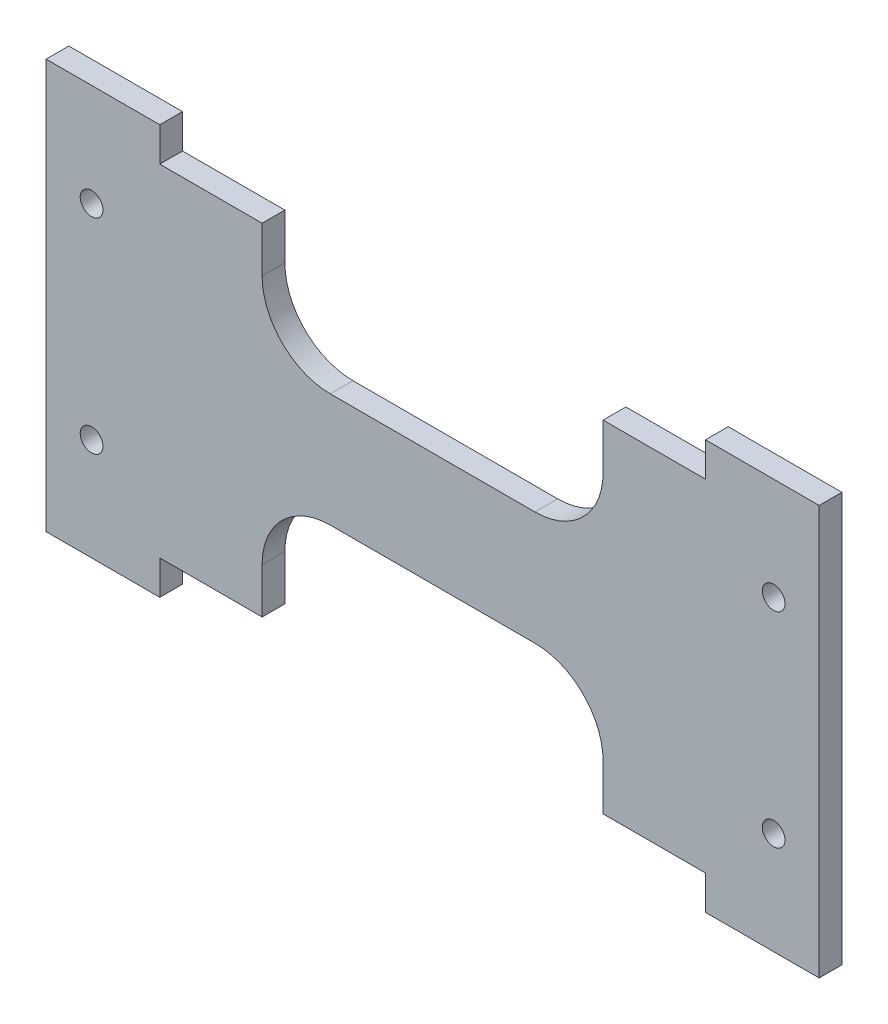
ISO-10303-21;
HEADER;
FILE_DESCRIPTION(('STEP AP214'),'2;1');
FILE_NAME('part.step','',(''),(''),'','','');
FILE_SCHEMA(('AUTOMOTIVE_DESIGN { 1 0 10303 214 1 1 1 1 }'));
ENDSEC;
DATA;
#1=APPLICATION_CONTEXT('core data for automotive mechanical design processes');
#2=APPLICATION_PROTOCOL_DEFINITION('international standard','automotive_design',2000,#1);
#3=PRODUCT_CONTEXT('',#1,'mechanical');
#4=PRODUCT('Part','Part','',(#3));
#5=PRODUCT_RELATED_PRODUCT_CATEGORY('part','',(#4));
#6=PRODUCT_DEFINITION_FORMATION('','',#4);
#7=PRODUCT_DEFINITION_CONTEXT('part definition',#1,'design');
#8=PRODUCT_DEFINITION('design','',#6,#7);
#9=PRODUCT_DEFINITION_SHAPE('','',#8);
#10=(LENGTH_UNIT() NAMED_UNIT(*) SI_UNIT(.MILLI.,.METRE.));
#11=(NAMED_UNIT(*) PLANE_ANGLE_UNIT() SI_UNIT($,.RADIAN.));
#12=(NAMED_UNIT(*) SI_UNIT($,.STERADIAN.) SOLID_ANGLE_UNIT());
#13=UNCERTAINTY_MEASURE_WITH_UNIT(LENGTH_MEASURE(1.E-05),#10,'distance_accuracy_value','');
#14=(GEOMETRIC_REPRESENTATION_CONTEXT(3) GLOBAL_UNCERTAINTY_ASSIGNED_CONTEXT((#13)) GLOBAL_UNIT_ASSIGNED_CONTEXT((#10,
#11,#12)) REPRESENTATION_CONTEXT('',''));
#15=CARTESIAN_POINT('',(0.,0.,0.));
#16=DIRECTION('',(0.,0.,1.));
#17=DIRECTION('',(1.,0.,0.));
#18=AXIS2_PLACEMENT_3D('',#15,#16,#17);
#19=CARTESIAN_POINT('',(8.99999999999999,-5.99999999999999,2.));
#20=DIRECTION('',(0.,0.,1.));
#21=DIRECTION('',(1.,0.,0.));
#22=AXIS2_PLACEMENT_3D('',#19,#20,#21);
#23=PLANE('',#22);
#24=CARTESIAN_POINT('',(-30.,14.,2.));
#25=DIRECTION('',(0.,0.,1.));
#26=DIRECTION('',(1.,0.,0.));
#27=AXIS2_PLACEMENT_3D('',#24,#25,#26);
#28=CIRCLE('',#27,0.999999999999997);
#29=CARTESIAN_POINT('',(-29.,14.,2.));
#30=VERTEX_POINT('',#29);
#31=EDGE_CURVE('E458',#30,#30,#28,.T.);
#32=ORIENTED_EDGE('',*,*,#31,.F.);
#33=EDGE_LOOP('',(#32));
#34=FACE_BOUND('',#33,.T.);
#35=CARTESIAN_POINT('',(30.,-4.,2.));
#36=DIRECTION('',(0.,0.,1.));
#37=DIRECTION('',(1.,0.,0.));
#38=AXIS2_PLACEMENT_3D('',#35,#36,#37);
#39=CIRCLE('',#38,1.);
#40=CARTESIAN_POINT('',(31.,-4.,2.));
#41=VERTEX_POINT('',#40);
#42=EDGE_CURVE('E241',#41,#41,#39,.T.);
#43=ORIENTED_EDGE('',*,*,#42,.F.);
#44=EDGE_LOOP('',(#43));
#45=FACE_BOUND('',#44,.T.);
#46=CARTESIAN_POINT('',(8.99999999999999,-5.99999999999999,2.));
#47=DIRECTION('',(0.,0.,-1.));
#48=DIRECTION('',(1.,0.,0.));
#49=AXIS2_PLACEMENT_3D('',#46,#47,#48);
#50=CIRCLE('',#49,5.99999999999999);
#51=CARTESIAN_POINT('',(9.,0.,2.));
#52=VERTEX_POINT('',#51);
#53=CARTESIAN_POINT('',(15.,-6.,2.));
#54=VERTEX_POINT('',#53);
#55=EDGE_CURVE('E284',#52,#54,#50,.T.);
#56=ORIENTED_EDGE('',*,*,#55,.T.);
#57=DIRECTION('',(0.,-1.,0.));
#58=VECTOR('',#57,1.);
#59=CARTESIAN_POINT('',(15.,-10.,2.));
#60=LINE('',#59,#58);
#61=CARTESIAN_POINT('',(15.,-10.,2.));
#62=VERTEX_POINT('',#61);
#63=EDGE_CURVE('E152',#54,#62,#60,.T.);
#64=ORIENTED_EDGE('',*,*,#63,.T.);
#65=DIRECTION('',(1.,0.,0.));
#66=VECTOR('',#65,1.);
#67=CARTESIAN_POINT('',(24.,-10.,2.));
#68=LINE('',#67,#66);
#69=CARTESIAN_POINT('',(24.,-10.,2.));
#70=VERTEX_POINT('',#69);
#71=EDGE_CURVE('E347',#62,#70,#68,.T.);
#72=ORIENTED_EDGE('',*,*,#71,.T.);
#73=DIRECTION('',(0.,-1.,0.));
#74=VECTOR('',#73,1.);
#75=CARTESIAN_POINT('',(24.,-13.,2.));
#76=LINE('',#75,#74);
#77=CARTESIAN_POINT('',(24.,-13.,2.));
#78=VERTEX_POINT('',#77);
#79=EDGE_CURVE('E366',#70,#78,#76,.T.);
#80=ORIENTED_EDGE('',*,*,#79,.T.);
#81=DIRECTION('',(1.,0.,0.));
#82=VECTOR('',#81,1.);
#83=CARTESIAN_POINT('',(34.,-13.,2.));
#84=LINE('',#83,#82);
#85=CARTESIAN_POINT('',(34.,-13.,2.));
#86=VERTEX_POINT('',#85);
#87=EDGE_CURVE('E363',#78,#86,#84,.T.);
#88=ORIENTED_EDGE('',*,*,#87,.T.);
#89=DIRECTION('',(0.,1.,0.));
#90=VECTOR('',#89,1.);
#91=CARTESIAN_POINT('',(34.,23.,2.));
#92=LINE('',#91,#90);
#93=CARTESIAN_POINT('',(34.,23.,2.));
#94=VERTEX_POINT('',#93);
#95=EDGE_CURVE('E365',#86,#94,#92,.T.);
#96=ORIENTED_EDGE('',*,*,#95,.T.);
#97=DIRECTION('',(-1.,0.,0.));
#98=VECTOR('',#97,1.);
#99=CARTESIAN_POINT('',(24.,23.,2.));
#100=LINE('',#99,#98);
#101=CARTESIAN_POINT('',(24.,23.,2.));
#102=VERTEX_POINT('',#101);
#103=EDGE_CURVE('E368',#94,#102,#100,.T.);
#104=ORIENTED_EDGE('',*,*,#103,.T.);
#105=DIRECTION('',(0.,-1.,0.));
#106=VECTOR('',#105,1.);
#107=CARTESIAN_POINT('',(24.,20.,2.));
#108=LINE('',#107,#106);
#109=CARTESIAN_POINT('',(24.,20.,2.));
#110=VERTEX_POINT('',#109);
#111=EDGE_CURVE('E374',#102,#110,#108,.T.);
#112=ORIENTED_EDGE('',*,*,#111,.T.);
#113=DIRECTION('',(-1.,0.,0.));
#114=VECTOR('',#113,1.);
#115=CARTESIAN_POINT('',(15.,20.,2.));
#116=LINE('',#115,#114);
#117=CARTESIAN_POINT('',(15.,20.,2.));
#118=VERTEX_POINT('',#117);
#119=EDGE_CURVE('E376',#110,#118,#116,.T.);
#120=ORIENTED_EDGE('',*,*,#119,.T.);
#121=DIRECTION('',(0.,-1.,0.));
#122=VECTOR('',#121,1.);
#123=CARTESIAN_POINT('',(15.,16.,2.));
#124=LINE('',#123,#122);
#125=CARTESIAN_POINT('',(15.,16.,2.));
#126=VERTEX_POINT('',#125);
#127=EDGE_CURVE('E378',#118,#126,#124,.T.);
#128=ORIENTED_EDGE('',*,*,#127,.T.);
#129=CARTESIAN_POINT('',(9.,16.,2.));
#130=DIRECTION('',(0.,0.,-1.));
#131=DIRECTION('',(1.,0.,0.));
#132=AXIS2_PLACEMENT_3D('',#129,#130,#131);
#133=CIRCLE('',#132,6.);
#134=CARTESIAN_POINT('',(9.,10.,2.));
#135=VERTEX_POINT('',#134);
#136=EDGE_CURVE('E380',#126,#135,#133,.T.);
#137=ORIENTED_EDGE('',*,*,#136,.T.);
#138=DIRECTION('',(-1.,0.,0.));
#139=VECTOR('',#138,1.);
#140=CARTESIAN_POINT('',(-9.,10.,2.));
#141=LINE('',#140,#139);
#142=CARTESIAN_POINT('',(-9.,10.,2.));
#143=VERTEX_POINT('',#142);
#144=EDGE_CURVE('E382',#135,#143,#141,.T.);
#145=ORIENTED_EDGE('',*,*,#144,.T.);
#146=CARTESIAN_POINT('',(-9.,16.,2.));
#147=DIRECTION('',(0.,0.,-1.));
#148=DIRECTION('',(1.,0.,0.));
#149=AXIS2_PLACEMENT_3D('',#146,#147,#148);
#150=CIRCLE('',#149,6.);
#151=CARTESIAN_POINT('',(-15.,16.,2.));
#152=VERTEX_POINT('',#151);
#153=EDGE_CURVE('E384',#143,#152,#150,.T.);
#154=ORIENTED_EDGE('',*,*,#153,.T.);
#155=DIRECTION('',(0.,1.,0.));
#156=VECTOR('',#155,1.);
#157=CARTESIAN_POINT('',(-15.,20.,2.));
#158=LINE('',#157,#156);
#159=CARTESIAN_POINT('',(-15.,20.,2.));
#160=VERTEX_POINT('',#159);
#161=EDGE_CURVE('E386',#152,#160,#158,.T.);
#162=ORIENTED_EDGE('',*,*,#161,.T.);
#163=DIRECTION('',(-1.,0.,0.));
#164=VECTOR('',#163,1.);
#165=CARTESIAN_POINT('',(-24.,20.,2.));
#166=LINE('',#165,#164);
#167=CARTESIAN_POINT('',(-24.,20.,2.));
#168=VERTEX_POINT('',#167);
#169=EDGE_CURVE('E388',#160,#168,#166,.T.);
#170=ORIENTED_EDGE('',*,*,#169,.T.);
#171=DIRECTION('',(0.,1.,0.));
#172=VECTOR('',#171,1.);
#173=CARTESIAN_POINT('',(-24.,23.,2.));
#174=LINE('',#173,#172);
#175=CARTESIAN_POINT('',(-24.,23.,2.));
#176=VERTEX_POINT('',#175);
#177=EDGE_CURVE('E390',#168,#176,#174,.T.);
#178=ORIENTED_EDGE('',*,*,#177,.T.);
#179=DIRECTION('',(-1.,0.,0.));
#180=VECTOR('',#179,1.);
#181=CARTESIAN_POINT('',(-34.,23.,2.));
#182=LINE('',#181,#180);
#183=CARTESIAN_POINT('',(-34.,23.,2.));
#184=VERTEX_POINT('',#183);
#185=EDGE_CURVE('E392',#176,#184,#182,.T.);
#186=ORIENTED_EDGE('',*,*,#185,.T.);
#187=DIRECTION('',(0.,-1.,0.));
#188=VECTOR('',#187,1.);
#189=CARTESIAN_POINT('',(-34.,-13.,2.));
#190=LINE('',#189,#188);
#191=CARTESIAN_POINT('',(-34.,-13.,2.));
#192=VERTEX_POINT('',#191);
#193=EDGE_CURVE('E394',#184,#192,#190,.T.);
#194=ORIENTED_EDGE('',*,*,#193,.T.);
#195=DIRECTION('',(1.,0.,0.));
#196=VECTOR('',#195,1.);
#197=CARTESIAN_POINT('',(-24.,-13.,2.));
#198=LINE('',#197,#196);
#199=CARTESIAN_POINT('',(-24.,-13.,2.));
#200=VERTEX_POINT('',#199);
#201=EDGE_CURVE('E396',#192,#200,#198,.T.);
#202=ORIENTED_EDGE('',*,*,#201,.T.);
#203=DIRECTION('',(0.,1.,0.));
#204=VECTOR('',#203,1.);
#205=CARTESIAN_POINT('',(-24.,-10.,2.));
#206=LINE('',#205,#204);
#207=CARTESIAN_POINT('',(-24.,-10.,2.));
#208=VERTEX_POINT('',#207);
#209=EDGE_CURVE('E398',#200,#208,#206,.T.);
#210=ORIENTED_EDGE('',*,*,#209,.T.);
#211=DIRECTION('',(1.,0.,0.));
#212=VECTOR('',#211,1.);
#213=CARTESIAN_POINT('',(-15.,-10.,2.));
#214=LINE('',#213,#212);
#215=CARTESIAN_POINT('',(-15.,-10.,2.));
#216=VERTEX_POINT('',#215);
#217=EDGE_CURVE('E219',#208,#216,#214,.T.);
#218=ORIENTED_EDGE('',*,*,#217,.T.);
#219=DIRECTION('',(0.,1.,0.));
#220=VECTOR('',#219,1.);
#221=CARTESIAN_POINT('',(-15.,-6.,2.));
#222=LINE('',#221,#220);
#223=CARTESIAN_POINT('',(-15.,-6.,2.));
#224=VERTEX_POINT('',#223);
#225=EDGE_CURVE('E213',#216,#224,#222,.T.);
#226=ORIENTED_EDGE('',*,*,#225,.T.);
#227=CARTESIAN_POINT('',(-9.,-6.,2.));
#228=DIRECTION('',(0.,0.,-1.));
#229=DIRECTION('',(1.,0.,0.));
#230=AXIS2_PLACEMENT_3D('',#227,#228,#229);
#231=CIRCLE('',#230,6.);
#232=CARTESIAN_POINT('',(-9.,0.,2.));
#233=VERTEX_POINT('',#232);
#234=EDGE_CURVE('E217',#224,#233,#231,.T.);
#235=ORIENTED_EDGE('',*,*,#234,.T.);
#236=DIRECTION('',(1.,0.,0.));
#237=VECTOR('',#236,1.);
#238=CARTESIAN_POINT('',(9.,0.,2.));
#239=LINE('',#238,#237);
#240=EDGE_CURVE('E61',#233,#52,#239,.T.);
#241=ORIENTED_EDGE('',*,*,#240,.T.);
#242=EDGE_LOOP('',(#56,#64,#72,#80,#88,#96,#104,#112,#120,#128,#137,#145,#154,#162,#170,#178,
#186,#194,#202,#210,#218,#226,#235,#241));
#243=FACE_BOUND('',#242,.T.);
#244=CARTESIAN_POINT('',(30.,14.,2.));
#245=DIRECTION('',(0.,0.,1.));
#246=DIRECTION('',(1.,0.,0.));
#247=AXIS2_PLACEMENT_3D('',#244,#245,#246);
#248=CIRCLE('',#247,0.999999999999997);
#249=CARTESIAN_POINT('',(31.,14.,2.));
#250=VERTEX_POINT('',#249);
#251=EDGE_CURVE('E464',#250,#250,#248,.T.);
#252=ORIENTED_EDGE('',*,*,#251,.F.);
#253=EDGE_LOOP('',(#252));
#254=FACE_BOUND('',#253,.T.);
#255=CARTESIAN_POINT('',(-30.,-4.,2.));
#256=DIRECTION('',(0.,0.,1.));
#257=DIRECTION('',(1.,0.,0.));
#258=AXIS2_PLACEMENT_3D('',#255,#256,#257);
#259=CIRCLE('',#258,0.999999999999997);
#260=CARTESIAN_POINT('',(-29.,-4.,2.));
#261=VERTEX_POINT('',#260);
#262=EDGE_CURVE('E449',#261,#261,#259,.T.);
#263=ORIENTED_EDGE('',*,*,#262,.F.);
#264=EDGE_LOOP('',(#263));
#265=FACE_BOUND('',#264,.T.);
#266=ADVANCED_FACE('F44',(#34,#45,#243,#254,#265),#23,.T.);
#267=CARTESIAN_POINT('',(8.99999999999999,-5.99999999999999,0.));
#268=DIRECTION('',(0.,0.,1.));
#269=DIRECTION('',(1.,0.,0.));
#270=AXIS2_PLACEMENT_3D('',#267,#268,#269);
#271=PLANE('',#270);
#272=CARTESIAN_POINT('',(8.99999999999999,-5.99999999999999,0.));
#273=DIRECTION('',(0.,0.,-1.));
#274=DIRECTION('',(1.,0.,0.));
#275=AXIS2_PLACEMENT_3D('',#272,#273,#274);
#276=CIRCLE('',#275,5.99999999999999);
#277=CARTESIAN_POINT('',(9.,0.,0.));
#278=VERTEX_POINT('',#277);
#279=CARTESIAN_POINT('',(15.,-6.,0.));
#280=VERTEX_POINT('',#279);
#281=EDGE_CURVE('E237',#278,#280,#276,.T.);
#282=ORIENTED_EDGE('',*,*,#281,.F.);
#283=DIRECTION('',(1.,0.,0.));
#284=VECTOR('',#283,1.);
#285=CARTESIAN_POINT('',(9.,0.,0.));
#286=LINE('',#285,#284);
#287=CARTESIAN_POINT('',(-9.,0.,0.));
#288=VERTEX_POINT('',#287);
#289=EDGE_CURVE('E144',#288,#278,#286,.T.);
#290=ORIENTED_EDGE('',*,*,#289,.F.);
#291=CARTESIAN_POINT('',(-9.,-6.,0.));
#292=DIRECTION('',(0.,0.,-1.));
#293=DIRECTION('',(1.,0.,0.));
#294=AXIS2_PLACEMENT_3D('',#291,#292,#293);
#295=CIRCLE('',#294,6.);
#296=CARTESIAN_POINT('',(-15.,-6.,0.));
#297=VERTEX_POINT('',#296);
#298=EDGE_CURVE('E138',#297,#288,#295,.T.);
#299=ORIENTED_EDGE('',*,*,#298,.F.);
#300=DIRECTION('',(0.,1.,0.));
#301=VECTOR('',#300,1.);
#302=CARTESIAN_POINT('',(-15.,-6.,0.));
#303=LINE('',#302,#301);
#304=CARTESIAN_POINT('',(-15.,-10.,0.));
#305=VERTEX_POINT('',#304);
#306=EDGE_CURVE('E227',#305,#297,#303,.T.);
#307=ORIENTED_EDGE('',*,*,#306,.F.);
#308=DIRECTION('',(1.,0.,0.));
#309=VECTOR('',#308,1.);
#310=CARTESIAN_POINT('',(-15.,-10.,0.));
#311=LINE('',#310,#309);
#312=CARTESIAN_POINT('',(-24.,-10.,0.));
#313=VERTEX_POINT('',#312);
#314=EDGE_CURVE('E279',#313,#305,#311,.T.);
#315=ORIENTED_EDGE('',*,*,#314,.F.);
#316=DIRECTION('',(0.,1.,0.));
#317=VECTOR('',#316,1.);
#318=CARTESIAN_POINT('',(-24.,-10.,0.));
#319=LINE('',#318,#317);
#320=CARTESIAN_POINT('',(-24.,-13.,0.));
#321=VERTEX_POINT('',#320);
#322=EDGE_CURVE('E277',#321,#313,#319,.T.);
#323=ORIENTED_EDGE('',*,*,#322,.F.);
#324=DIRECTION('',(1.,0.,0.));
#325=VECTOR('',#324,1.);
#326=CARTESIAN_POINT('',(-24.,-13.,0.));
#327=LINE('',#326,#325);
#328=CARTESIAN_POINT('',(-34.,-13.,0.));
#329=VERTEX_POINT('',#328);
#330=EDGE_CURVE('E275',#329,#321,#327,.T.);
#331=ORIENTED_EDGE('',*,*,#330,.F.);
#332=DIRECTION('',(0.,-1.,0.));
#333=VECTOR('',#332,1.);
#334=CARTESIAN_POINT('',(-34.,-13.,0.));
#335=LINE('',#334,#333);
#336=CARTESIAN_POINT('',(-34.,23.,0.));
#337=VERTEX_POINT('',#336);
#338=EDGE_CURVE('E273',#337,#329,#335,.T.);
#339=ORIENTED_EDGE('',*,*,#338,.F.);
#340=DIRECTION('',(-1.,0.,0.));
#341=VECTOR('',#340,1.);
#342=CARTESIAN_POINT('',(-34.,23.,0.));
#343=LINE('',#342,#341);
#344=CARTESIAN_POINT('',(-24.,23.,0.));
#345=VERTEX_POINT('',#344);
#346=EDGE_CURVE('E271',#345,#337,#343,.T.);
#347=ORIENTED_EDGE('',*,*,#346,.F.);
#348=DIRECTION('',(0.,1.,0.));
#349=VECTOR('',#348,1.);
#350=CARTESIAN_POINT('',(-24.,23.,0.));
#351=LINE('',#350,#349);
#352=CARTESIAN_POINT('',(-24.,20.,0.));
#353=VERTEX_POINT('',#352);
#354=EDGE_CURVE('E269',#353,#345,#351,.T.);
#355=ORIENTED_EDGE('',*,*,#354,.F.);
#356=DIRECTION('',(-1.,0.,0.));
#357=VECTOR('',#356,1.);
#358=CARTESIAN_POINT('',(-24.,20.,0.));
#359=LINE('',#358,#357);
#360=CARTESIAN_POINT('',(-15.,20.,0.));
#361=VERTEX_POINT('',#360);
#362=EDGE_CURVE('E267',#361,#353,#359,.T.);
#363=ORIENTED_EDGE('',*,*,#362,.F.);
#364=DIRECTION('',(0.,1.,0.));
#365=VECTOR('',#364,1.);
#366=CARTESIAN_POINT('',(-15.,20.,0.));
#367=LINE('',#366,#365);
#368=CARTESIAN_POINT('',(-15.,16.,0.));
#369=VERTEX_POINT('',#368);
#370=EDGE_CURVE('E265',#369,#361,#367,.T.);
#371=ORIENTED_EDGE('',*,*,#370,.F.);
#372=CARTESIAN_POINT('',(-9.,16.,0.));
#373=DIRECTION('',(0.,0.,-1.));
#374=DIRECTION('',(1.,0.,0.));
#375=AXIS2_PLACEMENT_3D('',#372,#373,#374);
#376=CIRCLE('',#375,6.);
#377=CARTESIAN_POINT('',(-9.,10.,0.));
#378=VERTEX_POINT('',#377);
#379=EDGE_CURVE('E263',#378,#369,#376,.T.);
#380=ORIENTED_EDGE('',*,*,#379,.F.);
#381=DIRECTION('',(-1.,0.,0.));
#382=VECTOR('',#381,1.);
#383=CARTESIAN_POINT('',(-9.,10.,0.));
#384=LINE('',#383,#382);
#385=CARTESIAN_POINT('',(9.,10.,0.));
#386=VERTEX_POINT('',#385);
#387=EDGE_CURVE('E261',#386,#378,#384,.T.);
#388=ORIENTED_EDGE('',*,*,#387,.F.);
#389=CARTESIAN_POINT('',(9.,16.,0.));
#390=DIRECTION('',(0.,0.,-1.));
#391=DIRECTION('',(1.,0.,0.));
#392=AXIS2_PLACEMENT_3D('',#389,#390,#391);
#393=CIRCLE('',#392,6.);
#394=CARTESIAN_POINT('',(15.,16.,0.));
#395=VERTEX_POINT('',#394);
#396=EDGE_CURVE('E259',#395,#386,#393,.T.);
#397=ORIENTED_EDGE('',*,*,#396,.F.);
#398=DIRECTION('',(0.,-1.,0.));
#399=VECTOR('',#398,1.);
#400=CARTESIAN_POINT('',(15.,16.,0.));
#401=LINE('',#400,#399);
#402=CARTESIAN_POINT('',(15.,20.,0.));
#403=VERTEX_POINT('',#402);
#404=EDGE_CURVE('E257',#403,#395,#401,.T.);
#405=ORIENTED_EDGE('',*,*,#404,.F.);
#406=DIRECTION('',(-1.,0.,0.));
#407=VECTOR('',#406,1.);
#408=CARTESIAN_POINT('',(15.,20.,0.));
#409=LINE('',#408,#407);
#410=CARTESIAN_POINT('',(24.,20.,0.));
#411=VERTEX_POINT('',#410);
#412=EDGE_CURVE('E255',#411,#403,#409,.T.);
#413=ORIENTED_EDGE('',*,*,#412,.F.);
#414=DIRECTION('',(0.,-1.,0.));
#415=VECTOR('',#414,1.);
#416=CARTESIAN_POINT('',(24.,20.,0.));
#417=LINE('',#416,#415);
#418=CARTESIAN_POINT('',(24.,23.,0.));
#419=VERTEX_POINT('',#418);
#420=EDGE_CURVE('E253',#419,#411,#417,.T.);
#421=ORIENTED_EDGE('',*,*,#420,.F.);
#422=DIRECTION('',(-1.,0.,0.));
#423=VECTOR('',#422,1.);
#424=CARTESIAN_POINT('',(24.,23.,0.));
#425=LINE('',#424,#423);
#426=CARTESIAN_POINT('',(34.,23.,0.));
#427=VERTEX_POINT('',#426);
#428=EDGE_CURVE('E251',#427,#419,#425,.T.);
#429=ORIENTED_EDGE('',*,*,#428,.F.);
#430=DIRECTION('',(0.,1.,0.));
#431=VECTOR('',#430,1.);
#432=CARTESIAN_POINT('',(34.,23.,0.));
#433=LINE('',#432,#431);
#434=CARTESIAN_POINT('',(34.,-13.,0.));
#435=VERTEX_POINT('',#434);
#436=EDGE_CURVE('E249',#435,#427,#433,.T.);
#437=ORIENTED_EDGE('',*,*,#436,.F.);
#438=DIRECTION('',(1.,0.,0.));
#439=VECTOR('',#438,1.);
#440=CARTESIAN_POINT('',(34.,-13.,0.));
#441=LINE('',#440,#439);
#442=CARTESIAN_POINT('',(24.,-13.,0.));
#443=VERTEX_POINT('',#442);
#444=EDGE_CURVE('E247',#443,#435,#441,.T.);
#445=ORIENTED_EDGE('',*,*,#444,.F.);
#446=DIRECTION('',(0.,-1.,0.));
#447=VECTOR('',#446,1.);
#448=CARTESIAN_POINT('',(24.,-13.,0.));
#449=LINE('',#448,#447);
#450=CARTESIAN_POINT('',(24.,-10.,0.));
#451=VERTEX_POINT('',#450);
#452=EDGE_CURVE('E245',#451,#443,#449,.T.);
#453=ORIENTED_EDGE('',*,*,#452,.F.);
#454=DIRECTION('',(1.,0.,0.));
#455=VECTOR('',#454,1.);
#456=CARTESIAN_POINT('',(24.,-10.,0.));
#457=LINE('',#456,#455);
#458=CARTESIAN_POINT('',(15.,-10.,0.));
#459=VERTEX_POINT('',#458);
#460=EDGE_CURVE('E243',#459,#451,#457,.T.);
#461=ORIENTED_EDGE('',*,*,#460,.F.);
#462=DIRECTION('',(0.,-1.,0.));
#463=VECTOR('',#462,1.);
#464=CARTESIAN_POINT('',(15.,-10.,0.));
#465=LINE('',#464,#463);
#466=EDGE_CURVE('E240',#280,#459,#465,.T.);
#467=ORIENTED_EDGE('',*,*,#466,.F.);
#468=EDGE_LOOP('',(#282,#290,#299,#307,#315,#323,#331,#339,#347,#355,#363,#371,#380,#388,#397,
#405,#413,#421,#429,#437,#445,#453,#461,#467));
#469=FACE_BOUND('',#468,.T.);
#470=CARTESIAN_POINT('',(30.,-4.,0.));
#471=DIRECTION('',(0.,0.,1.));
#472=DIRECTION('',(1.,0.,0.));
#473=AXIS2_PLACEMENT_3D('',#470,#471,#472);
#474=CIRCLE('',#473,1.);
#475=CARTESIAN_POINT('',(31.,-4.,0.));
#476=VERTEX_POINT('',#475);
#477=EDGE_CURVE('E467',#476,#476,#474,.T.);
#478=ORIENTED_EDGE('',*,*,#477,.T.);
#479=EDGE_LOOP('',(#478));
#480=FACE_BOUND('',#479,.T.);
#481=CARTESIAN_POINT('',(30.,14.,0.));
#482=DIRECTION('',(0.,0.,1.));
#483=DIRECTION('',(1.,0.,0.));
#484=AXIS2_PLACEMENT_3D('',#481,#482,#483);
#485=CIRCLE('',#484,0.999999999999997);
#486=CARTESIAN_POINT('',(31.,14.,0.));
#487=VERTEX_POINT('',#486);
#488=EDGE_CURVE('E461',#487,#487,#485,.T.);
#489=ORIENTED_EDGE('',*,*,#488,.T.);
#490=EDGE_LOOP('',(#489));
#491=FACE_BOUND('',#490,.T.);
#492=CARTESIAN_POINT('',(-30.,14.,0.));
#493=DIRECTION('',(0.,0.,1.));
#494=DIRECTION('',(1.,0.,0.));
#495=AXIS2_PLACEMENT_3D('',#492,#493,#494);
#496=CIRCLE('',#495,0.999999999999997);
#497=CARTESIAN_POINT('',(-29.,14.,0.));
#498=VERTEX_POINT('',#497);
#499=EDGE_CURVE('E455',#498,#498,#496,.T.);
#500=ORIENTED_EDGE('',*,*,#499,.T.);
#501=EDGE_LOOP('',(#500));
#502=FACE_BOUND('',#501,.T.);
#503=CARTESIAN_POINT('',(-30.,-4.,0.));
#504=DIRECTION('',(0.,0.,1.));
#505=DIRECTION('',(1.,0.,0.));
#506=AXIS2_PLACEMENT_3D('',#503,#504,#505);
#507=CIRCLE('',#506,0.999999999999997);
#508=CARTESIAN_POINT('',(-29.,-4.,0.));
#509=VERTEX_POINT('',#508);
#510=EDGE_CURVE('E452',#509,#509,#507,.T.);
#511=ORIENTED_EDGE('',*,*,#510,.T.);
#512=EDGE_LOOP('',(#511));
#513=FACE_BOUND('',#512,.T.);
#514=ADVANCED_FACE('F351',(#469,#480,#491,#502,#513),#271,.F.);
#515=CARTESIAN_POINT('',(8.99999999999999,-5.99999999999999,2.));
#516=DIRECTION('',(0.,0.,-1.));
#517=DIRECTION('',(-1.,0.,0.));
#518=AXIS2_PLACEMENT_3D('',#515,#516,#517);
#519=CYLINDRICAL_SURFACE('',#518,5.99999999999999);
#520=ORIENTED_EDGE('',*,*,#281,.T.);
#521=DIRECTION('',(0.,0.,-1.));
#522=VECTOR('',#521,1.);
#523=CARTESIAN_POINT('',(15.,-6.,2.));
#524=LINE('',#523,#522);
#525=EDGE_CURVE('E13',#54,#280,#524,.T.);
#526=ORIENTED_EDGE('',*,*,#525,.F.);
#527=ORIENTED_EDGE('',*,*,#55,.F.);
#528=DIRECTION('',(0.,0.,-1.));
#529=VECTOR('',#528,1.);
#530=CARTESIAN_POINT('',(9.,0.,2.));
#531=LINE('',#530,#529);
#532=EDGE_CURVE('E233',#52,#278,#531,.T.);
#533=ORIENTED_EDGE('',*,*,#532,.T.);
#534=EDGE_LOOP('',(#520,#526,#527,#533));
#535=FACE_BOUND('',#534,.T.);
#536=ADVANCED_FACE('F46',(#535),#519,.F.);
#537=CARTESIAN_POINT('',(15.,-10.,2.));
#538=DIRECTION('',(1.,0.,0.));
#539=DIRECTION('',(0.,1.,0.));
#540=AXIS2_PLACEMENT_3D('',#537,#538,#539);
#541=PLANE('',#540);
#542=ORIENTED_EDGE('',*,*,#466,.T.);
#543=DIRECTION('',(0.,0.,-1.));
#544=VECTOR('',#543,1.);
#545=CARTESIAN_POINT('',(15.,-10.,2.));
#546=LINE('',#545,#544);
#547=EDGE_CURVE('E53',#62,#459,#546,.T.);
#548=ORIENTED_EDGE('',*,*,#547,.F.);
#549=ORIENTED_EDGE('',*,*,#63,.F.);
#550=ORIENTED_EDGE('',*,*,#525,.T.);
#551=EDGE_LOOP('',(#542,#548,#549,#550));
#552=FACE_BOUND('',#551,.T.);
#553=ADVANCED_FACE('F653',(#552),#541,.F.);
#554=CARTESIAN_POINT('',(24.,-10.,2.));
#555=DIRECTION('',(0.,1.,0.));
#556=DIRECTION('',(0.,0.,1.));
#557=AXIS2_PLACEMENT_3D('',#554,#555,#556);
#558=PLANE('',#557);
#559=ORIENTED_EDGE('',*,*,#460,.T.);
#560=DIRECTION('',(0.,0.,-1.));
#561=VECTOR('',#560,1.);
#562=CARTESIAN_POINT('',(24.,-10.,2.));
#563=LINE('',#562,#561);
#564=EDGE_CURVE('E339',#70,#451,#563,.T.);
#565=ORIENTED_EDGE('',*,*,#564,.F.);
#566=ORIENTED_EDGE('',*,*,#71,.F.);
#567=ORIENTED_EDGE('',*,*,#547,.T.);
#568=EDGE_LOOP('',(#559,#565,#566,#567));
#569=FACE_BOUND('',#568,.T.);
#570=ADVANCED_FACE('F345',(#569),#558,.F.);
#571=CARTESIAN_POINT('',(24.,-13.,2.));
#572=DIRECTION('',(1.,0.,0.));
#573=DIRECTION('',(0.,0.,-1.));
#574=AXIS2_PLACEMENT_3D('',#571,#572,#573);
#575=PLANE('',#574);
#576=ORIENTED_EDGE('',*,*,#452,.T.);
#577=DIRECTION('',(0.,0.,-1.));
#578=VECTOR('',#577,1.);
#579=CARTESIAN_POINT('',(24.,-13.,2.));
#580=LINE('',#579,#578);
#581=EDGE_CURVE('E336',#78,#443,#580,.T.);
#582=ORIENTED_EDGE('',*,*,#581,.F.);
#583=ORIENTED_EDGE('',*,*,#79,.F.);
#584=ORIENTED_EDGE('',*,*,#564,.T.);
#585=EDGE_LOOP('',(#576,#582,#583,#584));
#586=FACE_BOUND('',#585,.T.);
#587=ADVANCED_FACE('F357',(#586),#575,.F.);
#588=CARTESIAN_POINT('',(34.,-13.,2.));
#589=DIRECTION('',(0.,1.,0.));
#590=DIRECTION('',(0.,0.,1.));
#591=AXIS2_PLACEMENT_3D('',#588,#589,#590);
#592=PLANE('',#591);
#593=ORIENTED_EDGE('',*,*,#444,.T.);
#594=DIRECTION('',(0.,0.,-1.));
#595=VECTOR('',#594,1.);
#596=CARTESIAN_POINT('',(34.,-13.,2.));
#597=LINE('',#596,#595);
#598=EDGE_CURVE('E333',#86,#435,#597,.T.);
#599=ORIENTED_EDGE('',*,*,#598,.F.);
#600=ORIENTED_EDGE('',*,*,#87,.F.);
#601=ORIENTED_EDGE('',*,*,#581,.T.);
#602=EDGE_LOOP('',(#593,#599,#600,#601));
#603=FACE_BOUND('',#602,.T.);
#604=ADVANCED_FACE('F361',(#603),#592,.F.);
#605=CARTESIAN_POINT('',(34.,23.,2.));
#606=DIRECTION('',(-1.,0.,0.));
#607=DIRECTION('',(0.,0.,1.));
#608=AXIS2_PLACEMENT_3D('',#605,#606,#607);
#609=PLANE('',#608);
#610=ORIENTED_EDGE('',*,*,#436,.T.);
#611=DIRECTION('',(0.,0.,-1.));
#612=VECTOR('',#611,1.);
#613=CARTESIAN_POINT('',(34.,23.,2.));
#614=LINE('',#613,#612);
#615=EDGE_CURVE('E330',#94,#427,#614,.T.);
#616=ORIENTED_EDGE('',*,*,#615,.F.);
#617=ORIENTED_EDGE('',*,*,#95,.F.);
#618=ORIENTED_EDGE('',*,*,#598,.T.);
#619=EDGE_LOOP('',(#610,#616,#617,#618));
#620=FACE_BOUND('',#619,.T.);
#621=ADVANCED_FACE('F626',(#620),#609,.F.);
#622=CARTESIAN_POINT('',(24.,23.,2.));
#623=DIRECTION('',(0.,-1.,0.));
#624=DIRECTION('',(0.,0.,-1.));
#625=AXIS2_PLACEMENT_3D('',#622,#623,#624);
#626=PLANE('',#625);
#627=ORIENTED_EDGE('',*,*,#428,.T.);
#628=DIRECTION('',(0.,0.,-1.));
#629=VECTOR('',#628,1.);
#630=CARTESIAN_POINT('',(24.,23.,2.));
#631=LINE('',#630,#629);
#632=EDGE_CURVE('E327',#102,#419,#631,.T.);
#633=ORIENTED_EDGE('',*,*,#632,.F.);
#634=ORIENTED_EDGE('',*,*,#103,.F.);
#635=ORIENTED_EDGE('',*,*,#615,.T.);
#636=EDGE_LOOP('',(#627,#633,#634,#635));
#637=FACE_BOUND('',#636,.T.);
#638=ADVANCED_FACE('F618',(#637),#626,.F.);
#639=CARTESIAN_POINT('',(24.,20.,2.));
#640=DIRECTION('',(1.,0.,0.));
#641=DIRECTION('',(0.,0.,-1.));
#642=AXIS2_PLACEMENT_3D('',#639,#640,#641);
#643=PLANE('',#642);
#644=ORIENTED_EDGE('',*,*,#420,.T.);
#645=DIRECTION('',(0.,0.,-1.));
#646=VECTOR('',#645,1.);
#647=CARTESIAN_POINT('',(24.,20.,2.));
#648=LINE('',#647,#646);
#649=EDGE_CURVE('E324',#110,#411,#648,.T.);
#650=ORIENTED_EDGE('',*,*,#649,.F.);
#651=ORIENTED_EDGE('',*,*,#111,.F.);
#652=ORIENTED_EDGE('',*,*,#632,.T.);
#653=EDGE_LOOP('',(#644,#650,#651,#652));
#654=FACE_BOUND('',#653,.T.);
#655=ADVANCED_FACE('F610',(#654),#643,.F.);
#656=CARTESIAN_POINT('',(15.,20.,2.));
#657=DIRECTION('',(0.,-1.,0.));
#658=DIRECTION('',(0.,0.,-1.));
#659=AXIS2_PLACEMENT_3D('',#656,#657,#658);
#660=PLANE('',#659);
#661=ORIENTED_EDGE('',*,*,#412,.T.);
#662=DIRECTION('',(0.,0.,-1.));
#663=VECTOR('',#662,1.);
#664=CARTESIAN_POINT('',(15.,20.,2.));
#665=LINE('',#664,#663);
#666=EDGE_CURVE('E321',#118,#403,#665,.T.);
#667=ORIENTED_EDGE('',*,*,#666,.F.);
#668=ORIENTED_EDGE('',*,*,#119,.F.);
#669=ORIENTED_EDGE('',*,*,#649,.T.);
#670=EDGE_LOOP('',(#661,#667,#668,#669));
#671=FACE_BOUND('',#670,.T.);
#672=ADVANCED_FACE('F602',(#671),#660,.F.);
#673=CARTESIAN_POINT('',(15.,16.,2.));
#674=DIRECTION('',(1.,0.,0.));
#675=DIRECTION('',(0.,0.,-1.));
#676=AXIS2_PLACEMENT_3D('',#673,#674,#675);
#677=PLANE('',#676);
#678=ORIENTED_EDGE('',*,*,#404,.T.);
#679=DIRECTION('',(0.,0.,-1.));
#680=VECTOR('',#679,1.);
#681=CARTESIAN_POINT('',(15.,16.,2.));
#682=LINE('',#681,#680);
#683=EDGE_CURVE('E318',#126,#395,#682,.T.);
#684=ORIENTED_EDGE('',*,*,#683,.F.);
#685=ORIENTED_EDGE('',*,*,#127,.F.);
#686=ORIENTED_EDGE('',*,*,#666,.T.);
#687=EDGE_LOOP('',(#678,#684,#685,#686));
#688=FACE_BOUND('',#687,.T.);
#689=ADVANCED_FACE('F594',(#688),#677,.F.);
#690=CARTESIAN_POINT('',(9.,16.,2.));
#691=DIRECTION('',(0.,0.,-1.));
#692=DIRECTION('',(-1.,0.,0.));
#693=AXIS2_PLACEMENT_3D('',#690,#691,#692);
#694=CYLINDRICAL_SURFACE('',#693,6.);
#695=ORIENTED_EDGE('',*,*,#396,.T.);
#696=DIRECTION('',(0.,0.,-1.));
#697=VECTOR('',#696,1.);
#698=CARTESIAN_POINT('',(9.,10.,2.));
#699=LINE('',#698,#697);
#700=EDGE_CURVE('E315',#135,#386,#699,.T.);
#701=ORIENTED_EDGE('',*,*,#700,.F.);
#702=ORIENTED_EDGE('',*,*,#136,.F.);
#703=ORIENTED_EDGE('',*,*,#683,.T.);
#704=EDGE_LOOP('',(#695,#701,#702,#703));
#705=FACE_BOUND('',#704,.T.);
#706=ADVANCED_FACE('F586',(#705),#694,.F.);
#707=CARTESIAN_POINT('',(-9.,10.,2.));
#708=DIRECTION('',(0.,-1.,0.));
#709=DIRECTION('',(0.,0.,-1.));
#710=AXIS2_PLACEMENT_3D('',#707,#708,#709);
#711=PLANE('',#710);
#712=ORIENTED_EDGE('',*,*,#387,.T.);
#713=DIRECTION('',(0.,0.,-1.));
#714=VECTOR('',#713,1.);
#715=CARTESIAN_POINT('',(-9.,10.,2.));
#716=LINE('',#715,#714);
#717=EDGE_CURVE('E312',#143,#378,#716,.T.);
#718=ORIENTED_EDGE('',*,*,#717,.F.);
#719=ORIENTED_EDGE('',*,*,#144,.F.);
#720=ORIENTED_EDGE('',*,*,#700,.T.);
#721=EDGE_LOOP('',(#712,#718,#719,#720));
#722=FACE_BOUND('',#721,.T.);
#723=ADVANCED_FACE('F578',(#722),#711,.F.);
#724=CARTESIAN_POINT('',(-9.,16.,2.));
#725=DIRECTION('',(0.,0.,-1.));
#726=DIRECTION('',(-1.,0.,0.));
#727=AXIS2_PLACEMENT_3D('',#724,#725,#726);
#728=CYLINDRICAL_SURFACE('',#727,6.);
#729=ORIENTED_EDGE('',*,*,#379,.T.);
#730=DIRECTION('',(0.,0.,-1.));
#731=VECTOR('',#730,1.);
#732=CARTESIAN_POINT('',(-15.,16.,2.));
#733=LINE('',#732,#731);
#734=EDGE_CURVE('E309',#152,#369,#733,.T.);
#735=ORIENTED_EDGE('',*,*,#734,.F.);
#736=ORIENTED_EDGE('',*,*,#153,.F.);
#737=ORIENTED_EDGE('',*,*,#717,.T.);
#738=EDGE_LOOP('',(#729,#735,#736,#737));
#739=FACE_BOUND('',#738,.T.);
#740=ADVANCED_FACE('F570',(#739),#728,.F.);
#741=CARTESIAN_POINT('',(-15.,20.,2.));
#742=DIRECTION('',(-1.,0.,0.));
#743=DIRECTION('',(0.,0.,1.));
#744=AXIS2_PLACEMENT_3D('',#741,#742,#743);
#745=PLANE('',#744);
#746=ORIENTED_EDGE('',*,*,#370,.T.);
#747=DIRECTION('',(0.,0.,-1.));
#748=VECTOR('',#747,1.);
#749=CARTESIAN_POINT('',(-15.,20.,2.));
#750=LINE('',#749,#748);
#751=EDGE_CURVE('E306',#160,#361,#750,.T.);
#752=ORIENTED_EDGE('',*,*,#751,.F.);
#753=ORIENTED_EDGE('',*,*,#161,.F.);
#754=ORIENTED_EDGE('',*,*,#734,.T.);
#755=EDGE_LOOP('',(#746,#752,#753,#754));
#756=FACE_BOUND('',#755,.T.);
#757=ADVANCED_FACE('F562',(#756),#745,.F.);
#758=CARTESIAN_POINT('',(-24.,20.,2.));
#759=DIRECTION('',(0.,-1.,0.));
#760=DIRECTION('',(0.,0.,-1.));
#761=AXIS2_PLACEMENT_3D('',#758,#759,#760);
#762=PLANE('',#761);
#763=ORIENTED_EDGE('',*,*,#362,.T.);
#764=DIRECTION('',(0.,0.,-1.));
#765=VECTOR('',#764,1.);
#766=CARTESIAN_POINT('',(-24.,20.,2.));
#767=LINE('',#766,#765);
#768=EDGE_CURVE('E303',#168,#353,#767,.T.);
#769=ORIENTED_EDGE('',*,*,#768,.F.);
#770=ORIENTED_EDGE('',*,*,#169,.F.);
#771=ORIENTED_EDGE('',*,*,#751,.T.);
#772=EDGE_LOOP('',(#763,#769,#770,#771));
#773=FACE_BOUND('',#772,.T.);
#774=ADVANCED_FACE('F554',(#773),#762,.F.);
#775=CARTESIAN_POINT('',(-24.,23.,2.));
#776=DIRECTION('',(-1.,0.,0.));
#777=DIRECTION('',(0.,0.,1.));
#778=AXIS2_PLACEMENT_3D('',#775,#776,#777);
#779=PLANE('',#778);
#780=ORIENTED_EDGE('',*,*,#354,.T.);
#781=DIRECTION('',(0.,0.,-1.));
#782=VECTOR('',#781,1.);
#783=CARTESIAN_POINT('',(-24.,23.,2.));
#784=LINE('',#783,#782);
#785=EDGE_CURVE('E300',#176,#345,#784,.T.);
#786=ORIENTED_EDGE('',*,*,#785,.F.);
#787=ORIENTED_EDGE('',*,*,#177,.F.);
#788=ORIENTED_EDGE('',*,*,#768,.T.);
#789=EDGE_LOOP('',(#780,#786,#787,#788));
#790=FACE_BOUND('',#789,.T.);
#791=ADVANCED_FACE('F546',(#790),#779,.F.);
#792=CARTESIAN_POINT('',(-34.,23.,2.));
#793=DIRECTION('',(0.,-1.,0.));
#794=DIRECTION('',(0.,0.,-1.));
#795=AXIS2_PLACEMENT_3D('',#792,#793,#794);
#796=PLANE('',#795);
#797=ORIENTED_EDGE('',*,*,#346,.T.);
#798=DIRECTION('',(0.,0.,-1.));
#799=VECTOR('',#798,1.);
#800=CARTESIAN_POINT('',(-34.,23.,2.));
#801=LINE('',#800,#799);
#802=EDGE_CURVE('E297',#184,#337,#801,.T.);
#803=ORIENTED_EDGE('',*,*,#802,.F.);
#804=ORIENTED_EDGE('',*,*,#185,.F.);
#805=ORIENTED_EDGE('',*,*,#785,.T.);
#806=EDGE_LOOP('',(#797,#803,#804,#805));
#807=FACE_BOUND('',#806,.T.);
#808=ADVANCED_FACE('F538',(#807),#796,.F.);
#809=CARTESIAN_POINT('',(-34.,-13.,2.));
#810=DIRECTION('',(1.,0.,0.));
#811=DIRECTION('',(0.,0.,-1.));
#812=AXIS2_PLACEMENT_3D('',#809,#810,#811);
#813=PLANE('',#812);
#814=ORIENTED_EDGE('',*,*,#338,.T.);
#815=DIRECTION('',(0.,0.,-1.));
#816=VECTOR('',#815,1.);
#817=CARTESIAN_POINT('',(-34.,-13.,2.));
#818=LINE('',#817,#816);
#819=EDGE_CURVE('E294',#192,#329,#818,.T.);
#820=ORIENTED_EDGE('',*,*,#819,.F.);
#821=ORIENTED_EDGE('',*,*,#193,.F.);
#822=ORIENTED_EDGE('',*,*,#802,.T.);
#823=EDGE_LOOP('',(#814,#820,#821,#822));
#824=FACE_BOUND('',#823,.T.);
#825=ADVANCED_FACE('F530',(#824),#813,.F.);
#826=CARTESIAN_POINT('',(-24.,-13.,2.));
#827=DIRECTION('',(0.,1.,0.));
#828=DIRECTION('',(0.,0.,1.));
#829=AXIS2_PLACEMENT_3D('',#826,#827,#828);
#830=PLANE('',#829);
#831=ORIENTED_EDGE('',*,*,#330,.T.);
#832=DIRECTION('',(0.,0.,-1.));
#833=VECTOR('',#832,1.);
#834=CARTESIAN_POINT('',(-24.,-13.,2.));
#835=LINE('',#834,#833);
#836=EDGE_CURVE('E291',#200,#321,#835,.T.);
#837=ORIENTED_EDGE('',*,*,#836,.F.);
#838=ORIENTED_EDGE('',*,*,#201,.F.);
#839=ORIENTED_EDGE('',*,*,#819,.T.);
#840=EDGE_LOOP('',(#831,#837,#838,#839));
#841=FACE_BOUND('',#840,.T.);
#842=ADVANCED_FACE('F523',(#841),#830,.F.);
#843=CARTESIAN_POINT('',(-24.,-10.,2.));
#844=DIRECTION('',(-1.,0.,0.));
#845=DIRECTION('',(0.,0.,1.));
#846=AXIS2_PLACEMENT_3D('',#843,#844,#845);
#847=PLANE('',#846);
#848=ORIENTED_EDGE('',*,*,#322,.T.);
#849=DIRECTION('',(0.,0.,-1.));
#850=VECTOR('',#849,1.);
#851=CARTESIAN_POINT('',(-24.,-10.,2.));
#852=LINE('',#851,#850);
#853=EDGE_CURVE('E288',#208,#313,#852,.T.);
#854=ORIENTED_EDGE('',*,*,#853,.F.);
#855=ORIENTED_EDGE('',*,*,#209,.F.);
#856=ORIENTED_EDGE('',*,*,#836,.T.);
#857=EDGE_LOOP('',(#848,#854,#855,#856));
#858=FACE_BOUND('',#857,.T.);
#859=ADVANCED_FACE('F404',(#858),#847,.F.);
#860=CARTESIAN_POINT('',(-15.,-10.,2.));
#861=DIRECTION('',(0.,1.,0.));
#862=DIRECTION('',(0.,0.,1.));
#863=AXIS2_PLACEMENT_3D('',#860,#861,#862);
#864=PLANE('',#863);
#865=ORIENTED_EDGE('',*,*,#314,.T.);
#866=DIRECTION('',(0.,0.,-1.));
#867=VECTOR('',#866,1.);
#868=CARTESIAN_POINT('',(-15.,-10.,2.));
#869=LINE('',#868,#867);
#870=EDGE_CURVE('E228',#216,#305,#869,.T.);
#871=ORIENTED_EDGE('',*,*,#870,.F.);
#872=ORIENTED_EDGE('',*,*,#217,.F.);
#873=ORIENTED_EDGE('',*,*,#853,.T.);
#874=EDGE_LOOP('',(#865,#871,#872,#873));
#875=FACE_BOUND('',#874,.T.);
#876=ADVANCED_FACE('F408',(#875),#864,.F.);
#877=CARTESIAN_POINT('',(-15.,-6.,2.));
#878=DIRECTION('',(-1.,0.,0.));
#879=DIRECTION('',(0.,0.,1.));
#880=AXIS2_PLACEMENT_3D('',#877,#878,#879);
#881=PLANE('',#880);
#882=ORIENTED_EDGE('',*,*,#306,.T.);
#883=DIRECTION('',(0.,0.,-1.));
#884=VECTOR('',#883,1.);
#885=CARTESIAN_POINT('',(-15.,-6.,2.));
#886=LINE('',#885,#884);
#887=EDGE_CURVE('E224',#224,#297,#886,.T.);
#888=ORIENTED_EDGE('',*,*,#887,.F.);
#889=ORIENTED_EDGE('',*,*,#225,.F.);
#890=ORIENTED_EDGE('',*,*,#870,.T.);
#891=EDGE_LOOP('',(#882,#888,#889,#890));
#892=FACE_BOUND('',#891,.T.);
#893=ADVANCED_FACE('F225',(#892),#881,.F.);
#894=CARTESIAN_POINT('',(-9.,-6.,2.));
#895=DIRECTION('',(0.,0.,-1.));
#896=DIRECTION('',(-1.,0.,0.));
#897=AXIS2_PLACEMENT_3D('',#894,#895,#896);
#898=CYLINDRICAL_SURFACE('',#897,6.);
#899=ORIENTED_EDGE('',*,*,#298,.T.);
#900=DIRECTION('',(0.,0.,-1.));
#901=VECTOR('',#900,1.);
#902=CARTESIAN_POINT('',(-9.,0.,2.));
#903=LINE('',#902,#901);
#904=EDGE_CURVE('E229',#233,#288,#903,.T.);
#905=ORIENTED_EDGE('',*,*,#904,.F.);
#906=ORIENTED_EDGE('',*,*,#234,.F.);
#907=ORIENTED_EDGE('',*,*,#887,.T.);
#908=EDGE_LOOP('',(#899,#905,#906,#907));
#909=FACE_BOUND('',#908,.T.);
#910=ADVANCED_FACE('F231',(#909),#898,.F.);
#911=CARTESIAN_POINT('',(9.,0.,2.));
#912=DIRECTION('',(0.,1.,0.));
#913=DIRECTION('',(-1.,0.,0.));
#914=AXIS2_PLACEMENT_3D('',#911,#912,#913);
#915=PLANE('',#914);
#916=ORIENTED_EDGE('',*,*,#289,.T.);
#917=ORIENTED_EDGE('',*,*,#532,.F.);
#918=ORIENTED_EDGE('',*,*,#240,.F.);
#919=ORIENTED_EDGE('',*,*,#904,.T.);
#920=EDGE_LOOP('',(#916,#917,#918,#919));
#921=FACE_BOUND('',#920,.T.);
#922=ADVANCED_FACE('F412',(#921),#915,.F.);
#923=CARTESIAN_POINT('',(30.,-4.,2.));
#924=DIRECTION('',(0.,0.,-1.));
#925=DIRECTION('',(-1.,0.,0.));
#926=AXIS2_PLACEMENT_3D('',#923,#924,#925);
#927=CYLINDRICAL_SURFACE('',#926,1.);
#928=ORIENTED_EDGE('',*,*,#42,.T.);
#929=EDGE_LOOP('',(#928));
#930=FACE_BOUND('',#929,.T.);
#931=ORIENTED_EDGE('',*,*,#477,.F.);
#932=EDGE_LOOP('',(#931));
#933=FACE_BOUND('',#932,.T.);
#934=ADVANCED_FACE('F414',(#930,#933),#927,.F.);
#935=CARTESIAN_POINT('',(30.,14.,2.));
#936=DIRECTION('',(0.,0.,-1.));
#937=DIRECTION('',(-1.,0.,0.));
#938=AXIS2_PLACEMENT_3D('',#935,#936,#937);
#939=CYLINDRICAL_SURFACE('',#938,0.999999999999997);
#940=ORIENTED_EDGE('',*,*,#251,.T.);
#941=EDGE_LOOP('',(#940));
#942=FACE_BOUND('',#941,.T.);
#943=ORIENTED_EDGE('',*,*,#488,.F.);
#944=EDGE_LOOP('',(#943));
#945=FACE_BOUND('',#944,.T.);
#946=ADVANCED_FACE('F420',(#942,#945),#939,.F.);
#947=CARTESIAN_POINT('',(-30.,14.,2.));
#948=DIRECTION('',(0.,0.,-1.));
#949=DIRECTION('',(-1.,0.,0.));
#950=AXIS2_PLACEMENT_3D('',#947,#948,#949);
#951=CYLINDRICAL_SURFACE('',#950,0.999999999999997);
#952=ORIENTED_EDGE('',*,*,#31,.T.);
#953=EDGE_LOOP('',(#952));
#954=FACE_BOUND('',#953,.T.);
#955=ORIENTED_EDGE('',*,*,#499,.F.);
#956=EDGE_LOOP('',(#955));
#957=FACE_BOUND('',#956,.T.);
#958=ADVANCED_FACE('F436',(#954,#957),#951,.F.);
#959=CARTESIAN_POINT('',(-30.,-4.,2.));
#960=DIRECTION('',(0.,0.,-1.));
#961=DIRECTION('',(-1.,0.,0.));
#962=AXIS2_PLACEMENT_3D('',#959,#960,#961);
#963=CYLINDRICAL_SURFACE('',#962,0.999999999999997);
#964=ORIENTED_EDGE('',*,*,#262,.T.);
#965=EDGE_LOOP('',(#964));
#966=FACE_BOUND('',#965,.T.);
#967=ORIENTED_EDGE('',*,*,#510,.F.);
#968=EDGE_LOOP('',(#967));
#969=FACE_BOUND('',#968,.T.);
#970=ADVANCED_FACE('F440',(#966,#969),#963,.F.);
#971=CLOSED_SHELL('',(#266,#514,#536,#553,#570,#587,#604,#621,#638,#655,#672,#689,#706,#723,
#740,#757,#774,#791,#808,#825,#842,#859,#876,#893,#910,#922,#934,#946,#958,#970));
#972=MANIFOLD_SOLID_BREP('B2',#971);
#973=ADVANCED_BREP_SHAPE_REPRESENTATION('',(#18,#972),#14);
#974=SHAPE_DEFINITION_REPRESENTATION(#9,#973);
ENDSEC;
END-ISO-10303-21;
